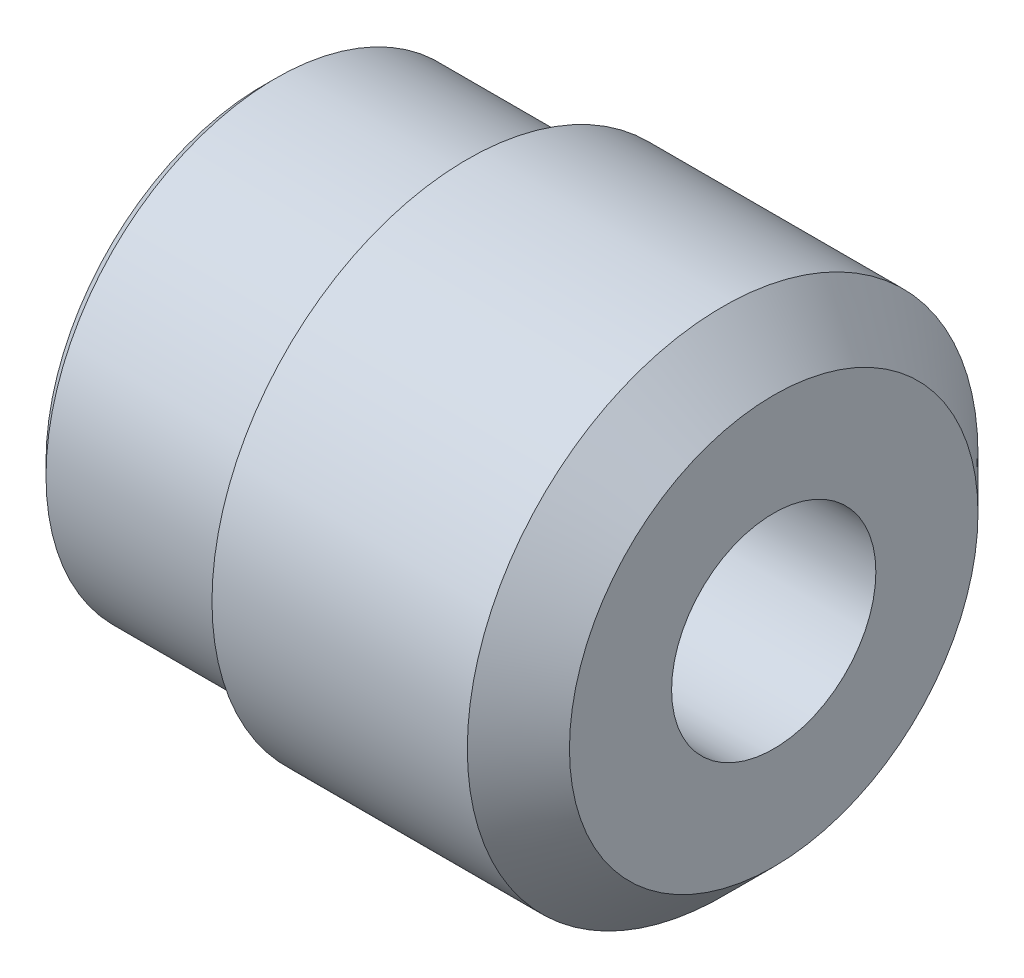
ISO-10303-21;
HEADER;
FILE_DESCRIPTION(('STEP AP214'),'2;1');
FILE_NAME('part.step','',(''),(''),'','','');
FILE_SCHEMA(('AUTOMOTIVE_DESIGN { 1 0 10303 214 1 1 1 1 }'));
ENDSEC;
DATA;
#1=APPLICATION_CONTEXT('core data for automotive mechanical design processes');
#2=APPLICATION_PROTOCOL_DEFINITION('international standard','automotive_design',2000,#1);
#3=PRODUCT_CONTEXT('',#1,'mechanical');
#4=PRODUCT('Part','Part','',(#3));
#5=PRODUCT_RELATED_PRODUCT_CATEGORY('part','',(#4));
#6=PRODUCT_DEFINITION_FORMATION('','',#4);
#7=PRODUCT_DEFINITION_CONTEXT('part definition',#1,'design');
#8=PRODUCT_DEFINITION('design','',#6,#7);
#9=PRODUCT_DEFINITION_SHAPE('','',#8);
#10=(LENGTH_UNIT() NAMED_UNIT(*) SI_UNIT(.MILLI.,.METRE.));
#11=(NAMED_UNIT(*) PLANE_ANGLE_UNIT() SI_UNIT($,.RADIAN.));
#12=(NAMED_UNIT(*) SI_UNIT($,.STERADIAN.) SOLID_ANGLE_UNIT());
#13=UNCERTAINTY_MEASURE_WITH_UNIT(LENGTH_MEASURE(1.E-05),#10,'distance_accuracy_value','');
#14=(GEOMETRIC_REPRESENTATION_CONTEXT(3) GLOBAL_UNCERTAINTY_ASSIGNED_CONTEXT((#13)) GLOBAL_UNIT_ASSIGNED_CONTEXT((#10,
#11,#12)) REPRESENTATION_CONTEXT('',''));
#15=CARTESIAN_POINT('',(0.,0.,0.));
#16=DIRECTION('',(0.,0.,1.));
#17=DIRECTION('',(1.,0.,0.));
#18=AXIS2_PLACEMENT_3D('',#15,#16,#17);
#19=CARTESIAN_POINT('',(0.,0.,0.));
#20=DIRECTION('',(-1.,0.,0.));
#21=DIRECTION('',(0.,0.,1.));
#22=AXIS2_PLACEMENT_3D('',#19,#20,#21);
#23=CYLINDRICAL_SURFACE('',#22,9.);
#24=CARTESIAN_POINT('',(0.500000000000004,0.,0.));
#25=DIRECTION('',(-1.,0.,0.));
#26=DIRECTION('',(0.,0.,1.));
#27=AXIS2_PLACEMENT_3D('',#24,#25,#26);
#28=CIRCLE('',#27,9.);
#29=CARTESIAN_POINT('',(0.500000000000004,0.,9.));
#30=VERTEX_POINT('',#29);
#31=EDGE_CURVE('E10',#30,#30,#28,.F.);
#32=ORIENTED_EDGE('',*,*,#31,.T.);
#33=EDGE_LOOP('',(#32));
#34=FACE_BOUND('',#33,.T.);
#35=CARTESIAN_POINT('',(8.,0.,0.));
#36=DIRECTION('',(-1.,0.,0.));
#37=DIRECTION('',(0.,0.,1.));
#38=AXIS2_PLACEMENT_3D('',#35,#36,#37);
#39=CIRCLE('',#38,9.);
#40=CARTESIAN_POINT('',(8.,0.,9.));
#41=VERTEX_POINT('',#40);
#42=EDGE_CURVE('E61',#41,#41,#39,.T.);
#43=ORIENTED_EDGE('',*,*,#42,.T.);
#44=EDGE_LOOP('',(#43));
#45=FACE_BOUND('',#44,.T.);
#46=ADVANCED_FACE('F27',(#34,#45),#23,.T.);
#47=CARTESIAN_POINT('',(0.,6.,0.));
#48=DIRECTION('',(-1.,0.,0.));
#49=DIRECTION('',(0.,0.,1.));
#50=AXIS2_PLACEMENT_3D('',#47,#48,#49);
#51=PLANE('',#50);
#52=CARTESIAN_POINT('',(0.,0.,0.));
#53=DIRECTION('',(-1.,0.,0.));
#54=DIRECTION('',(0.,0.,1.));
#55=AXIS2_PLACEMENT_3D('',#52,#53,#54);
#56=CIRCLE('',#55,8.49999999999999);
#57=CARTESIAN_POINT('',(0.,0.,8.49999999999999));
#58=VERTEX_POINT('',#57);
#59=EDGE_CURVE('E33',#58,#58,#56,.T.);
#60=ORIENTED_EDGE('',*,*,#59,.T.);
#61=EDGE_LOOP('',(#60));
#62=FACE_BOUND('',#61,.T.);
#63=CARTESIAN_POINT('',(0.,0.,0.));
#64=DIRECTION('',(-1.,0.,0.));
#65=DIRECTION('',(0.,0.,1.));
#66=AXIS2_PLACEMENT_3D('',#63,#64,#65);
#67=CIRCLE('',#66,6.);
#68=CARTESIAN_POINT('',(0.,0.,6.));
#69=VERTEX_POINT('',#68);
#70=EDGE_CURVE('E46',#69,#69,#67,.T.);
#71=ORIENTED_EDGE('',*,*,#70,.F.);
#72=EDGE_LOOP('',(#71));
#73=FACE_BOUND('',#72,.T.);
#74=ADVANCED_FACE('F83',(#62,#73),#51,.T.);
#75=CARTESIAN_POINT('',(0.,0.,0.));
#76=DIRECTION('',(-1.,0.,0.));
#77=DIRECTION('',(0.,0.,1.));
#78=AXIS2_PLACEMENT_3D('',#75,#76,#77);
#79=CYLINDRICAL_SURFACE('',#78,6.);
#80=CARTESIAN_POINT('',(14.,0.,0.));
#81=DIRECTION('',(-1.,0.,0.));
#82=DIRECTION('',(0.,0.,1.));
#83=AXIS2_PLACEMENT_3D('',#80,#81,#82);
#84=CIRCLE('',#83,6.);
#85=CARTESIAN_POINT('',(14.,0.,6.));
#86=VERTEX_POINT('',#85);
#87=EDGE_CURVE('E49',#86,#86,#84,.T.);
#88=ORIENTED_EDGE('',*,*,#87,.F.);
#89=EDGE_LOOP('',(#88));
#90=FACE_BOUND('',#89,.T.);
#91=ORIENTED_EDGE('',*,*,#70,.T.);
#92=EDGE_LOOP('',(#91));
#93=FACE_BOUND('',#92,.T.);
#94=ADVANCED_FACE('F87',(#90,#93),#79,.F.);
#95=CARTESIAN_POINT('',(14.,6.,0.));
#96=DIRECTION('',(1.,0.,0.));
#97=DIRECTION('',(0.,0.,-1.));
#98=AXIS2_PLACEMENT_3D('',#95,#96,#97);
#99=PLANE('',#98);
#100=CARTESIAN_POINT('',(14.,0.,0.));
#101=DIRECTION('',(-1.,0.,0.));
#102=DIRECTION('',(0.,0.,1.));
#103=AXIS2_PLACEMENT_3D('',#100,#101,#102);
#104=CIRCLE('',#103,4.);
#105=CARTESIAN_POINT('',(14.,0.,4.));
#106=VERTEX_POINT('',#105);
#107=EDGE_CURVE('E52',#106,#106,#104,.T.);
#108=ORIENTED_EDGE('',*,*,#107,.F.);
#109=EDGE_LOOP('',(#108));
#110=FACE_BOUND('',#109,.T.);
#111=ORIENTED_EDGE('',*,*,#87,.T.);
#112=EDGE_LOOP('',(#111));
#113=FACE_BOUND('',#112,.T.);
#114=ADVANCED_FACE('F91',(#110,#113),#99,.F.);
#115=CARTESIAN_POINT('',(0.,0.,0.));
#116=DIRECTION('',(-1.,0.,0.));
#117=DIRECTION('',(0.,0.,1.));
#118=AXIS2_PLACEMENT_3D('',#115,#116,#117);
#119=CYLINDRICAL_SURFACE('',#118,4.);
#120=CARTESIAN_POINT('',(20.,0.,0.));
#121=DIRECTION('',(-1.,0.,0.));
#122=DIRECTION('',(0.,0.,1.));
#123=AXIS2_PLACEMENT_3D('',#120,#121,#122);
#124=CIRCLE('',#123,4.);
#125=CARTESIAN_POINT('',(20.,0.,4.));
#126=VERTEX_POINT('',#125);
#127=EDGE_CURVE('E55',#126,#126,#124,.T.);
#128=ORIENTED_EDGE('',*,*,#127,.F.);
#129=EDGE_LOOP('',(#128));
#130=FACE_BOUND('',#129,.T.);
#131=ORIENTED_EDGE('',*,*,#107,.T.);
#132=EDGE_LOOP('',(#131));
#133=FACE_BOUND('',#132,.T.);
#134=ADVANCED_FACE('F98',(#130,#133),#119,.F.);
#135=CARTESIAN_POINT('',(20.,10.,0.));
#136=DIRECTION('',(1.,0.,0.));
#137=DIRECTION('',(0.,0.,-1.));
#138=AXIS2_PLACEMENT_3D('',#135,#136,#137);
#139=PLANE('',#138);
#140=CARTESIAN_POINT('',(20.,0.,0.));
#141=DIRECTION('',(1.,0.,0.));
#142=DIRECTION('',(0.,0.,-1.));
#143=AXIS2_PLACEMENT_3D('',#140,#141,#142);
#144=CIRCLE('',#143,7.99999999999999);
#145=CARTESIAN_POINT('',(20.,0.,-7.99999999999999));
#146=VERTEX_POINT('',#145);
#147=EDGE_CURVE('E37',#146,#146,#144,.T.);
#148=ORIENTED_EDGE('',*,*,#147,.T.);
#149=EDGE_LOOP('',(#148));
#150=FACE_BOUND('',#149,.T.);
#151=ORIENTED_EDGE('',*,*,#127,.T.);
#152=EDGE_LOOP('',(#151));
#153=FACE_BOUND('',#152,.T.);
#154=ADVANCED_FACE('F79',(#150,#153),#139,.T.);
#155=CARTESIAN_POINT('',(0.,0.,0.));
#156=DIRECTION('',(-1.,0.,0.));
#157=DIRECTION('',(0.,0.,1.));
#158=AXIS2_PLACEMENT_3D('',#155,#156,#157);
#159=CYLINDRICAL_SURFACE('',#158,10.);
#160=CARTESIAN_POINT('',(18.,0.,0.));
#161=DIRECTION('',(1.,0.,0.));
#162=DIRECTION('',(0.,0.,-1.));
#163=AXIS2_PLACEMENT_3D('',#160,#161,#162);
#164=CIRCLE('',#163,10.);
#165=CARTESIAN_POINT('',(18.,0.,-10.));
#166=VERTEX_POINT('',#165);
#167=EDGE_CURVE('E41',#166,#166,#164,.F.);
#168=ORIENTED_EDGE('',*,*,#167,.T.);
#169=EDGE_LOOP('',(#168));
#170=FACE_BOUND('',#169,.T.);
#171=CARTESIAN_POINT('',(8.,0.,0.));
#172=DIRECTION('',(-1.,0.,0.));
#173=DIRECTION('',(0.,0.,1.));
#174=AXIS2_PLACEMENT_3D('',#171,#172,#173);
#175=CIRCLE('',#174,10.);
#176=CARTESIAN_POINT('',(8.,0.,10.));
#177=VERTEX_POINT('',#176);
#178=EDGE_CURVE('E58',#177,#177,#175,.T.);
#179=ORIENTED_EDGE('',*,*,#178,.F.);
#180=EDGE_LOOP('',(#179));
#181=FACE_BOUND('',#180,.T.);
#182=ADVANCED_FACE('F69',(#170,#181),#159,.T.);
#183=CARTESIAN_POINT('',(8.,9.,0.));
#184=DIRECTION('',(-1.,0.,0.));
#185=DIRECTION('',(0.,0.,1.));
#186=AXIS2_PLACEMENT_3D('',#183,#184,#185);
#187=PLANE('',#186);
#188=ORIENTED_EDGE('',*,*,#178,.T.);
#189=EDGE_LOOP('',(#188));
#190=FACE_BOUND('',#189,.T.);
#191=ORIENTED_EDGE('',*,*,#42,.F.);
#192=EDGE_LOOP('',(#191));
#193=FACE_BOUND('',#192,.T.);
#194=ADVANCED_FACE('F66',(#190,#193),#187,.T.);
#195=CARTESIAN_POINT('',(18.,0.,0.));
#196=DIRECTION('',(-1.,0.,0.));
#197=DIRECTION('',(0.,0.,1.));
#198=AXIS2_PLACEMENT_3D('',#195,#196,#197);
#199=CONICAL_SURFACE('',#198,10.,0.785398163397443);
#200=ORIENTED_EDGE('',*,*,#147,.F.);
#201=EDGE_LOOP('',(#200));
#202=FACE_BOUND('',#201,.T.);
#203=ORIENTED_EDGE('',*,*,#167,.F.);
#204=EDGE_LOOP('',(#203));
#205=FACE_BOUND('',#204,.T.);
#206=ADVANCED_FACE('F68',(#202,#205),#199,.T.);
#207=CARTESIAN_POINT('',(0.,0.,0.));
#208=DIRECTION('',(1.,0.,0.));
#209=DIRECTION('',(0.,0.,-1.));
#210=AXIS2_PLACEMENT_3D('',#207,#208,#209);
#211=CONICAL_SURFACE('',#210,8.49999999999999,0.785398163397454);
#212=ORIENTED_EDGE('',*,*,#31,.F.);
#213=EDGE_LOOP('',(#212));
#214=FACE_BOUND('',#213,.T.);
#215=ORIENTED_EDGE('',*,*,#59,.F.);
#216=EDGE_LOOP('',(#215));
#217=FACE_BOUND('',#216,.T.);
#218=ADVANCED_FACE('F76',(#214,#217),#211,.T.);
#219=CLOSED_SHELL('',(#46,#74,#94,#114,#134,#154,#182,#194,#206,#218));
#220=MANIFOLD_SOLID_BREP('B2',#219);
#221=ADVANCED_BREP_SHAPE_REPRESENTATION('',(#18,#220),#14);
#222=SHAPE_DEFINITION_REPRESENTATION(#9,#221);
ENDSEC;
END-ISO-10303-21;
